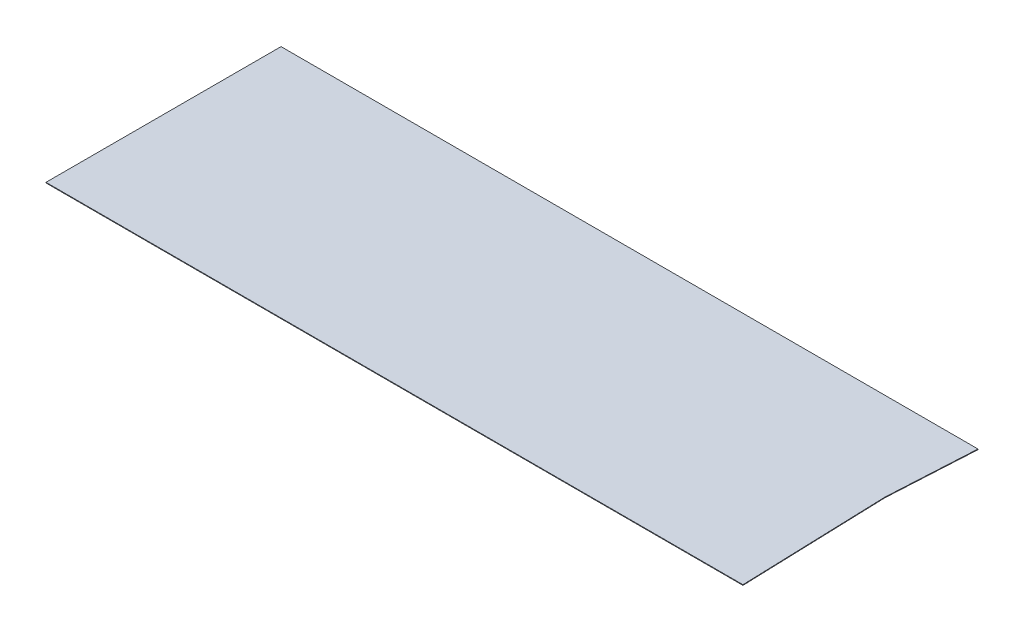
ISO-10303-21;
HEADER;
FILE_DESCRIPTION(('STEP AP214'),'2;1');
FILE_NAME('part.step','',(''),(''),'','','');
FILE_SCHEMA(('AUTOMOTIVE_DESIGN { 1 0 10303 214 1 1 1 1 }'));
ENDSEC;
DATA;
#1=APPLICATION_CONTEXT('core data for automotive mechanical design processes');
#2=APPLICATION_PROTOCOL_DEFINITION('international standard','automotive_design',2000,#1);
#3=PRODUCT_CONTEXT('',#1,'mechanical');
#4=PRODUCT('Part','Part','',(#3));
#5=PRODUCT_RELATED_PRODUCT_CATEGORY('part','',(#4));
#6=PRODUCT_DEFINITION_FORMATION('','',#4);
#7=PRODUCT_DEFINITION_CONTEXT('part definition',#1,'design');
#8=PRODUCT_DEFINITION('design','',#6,#7);
#9=PRODUCT_DEFINITION_SHAPE('','',#8);
#10=(LENGTH_UNIT() NAMED_UNIT(*) SI_UNIT(.MILLI.,.METRE.));
#11=(NAMED_UNIT(*) PLANE_ANGLE_UNIT() SI_UNIT($,.RADIAN.));
#12=(NAMED_UNIT(*) SI_UNIT($,.STERADIAN.) SOLID_ANGLE_UNIT());
#13=UNCERTAINTY_MEASURE_WITH_UNIT(LENGTH_MEASURE(1.E-05),#10,'distance_accuracy_value','');
#14=(GEOMETRIC_REPRESENTATION_CONTEXT(3) GLOBAL_UNCERTAINTY_ASSIGNED_CONTEXT((#13)) GLOBAL_UNIT_ASSIGNED_CONTEXT((#10,
#11,#12)) REPRESENTATION_CONTEXT('',''));
#15=CARTESIAN_POINT('',(0.,0.,0.));
#16=DIRECTION('',(0.,0.,1.));
#17=DIRECTION('',(1.,0.,0.));
#18=AXIS2_PLACEMENT_3D('',#15,#16,#17);
#19=CARTESIAN_POINT('',(-897.89,1.5875,304.8));
#20=DIRECTION('',(0.,0.,-1.));
#21=DIRECTION('',(-1.,0.,0.));
#22=AXIS2_PLACEMENT_3D('',#19,#20,#21);
#23=PLANE('',#22);
#24=DIRECTION('',(1.,0.,0.));
#25=VECTOR('',#24,1.);
#26=CARTESIAN_POINT('',(-897.89,0.,304.8));
#27=LINE('',#26,#25);
#28=CARTESIAN_POINT('',(-897.89,0.,304.8));
#29=VERTEX_POINT('',#28);
#30=CARTESIAN_POINT('',(909.766604995533,0.,304.8));
#31=VERTEX_POINT('',#30);
#32=EDGE_CURVE('E108',#29,#31,#27,.T.);
#33=ORIENTED_EDGE('',*,*,#32,.T.);
#34=DIRECTION('',(0.,-1.,0.));
#35=VECTOR('',#34,1.);
#36=CARTESIAN_POINT('',(909.766604995533,1.5875,304.8));
#37=LINE('',#36,#35);
#38=CARTESIAN_POINT('',(909.766604995533,1.5875,304.8));
#39=VERTEX_POINT('',#38);
#40=EDGE_CURVE('E11',#39,#31,#37,.T.);
#41=ORIENTED_EDGE('',*,*,#40,.F.);
#42=DIRECTION('',(1.,0.,0.));
#43=VECTOR('',#42,1.);
#44=CARTESIAN_POINT('',(-897.89,1.5875,304.8));
#45=LINE('',#44,#43);
#46=CARTESIAN_POINT('',(-897.89,1.5875,304.8));
#47=VERTEX_POINT('',#46);
#48=EDGE_CURVE('E116',#47,#39,#45,.T.);
#49=ORIENTED_EDGE('',*,*,#48,.F.);
#50=DIRECTION('',(0.,-1.,0.));
#51=VECTOR('',#50,1.);
#52=CARTESIAN_POINT('',(-897.89,1.5875,304.8));
#53=LINE('',#52,#51);
#54=EDGE_CURVE('E104',#47,#29,#53,.T.);
#55=ORIENTED_EDGE('',*,*,#54,.T.);
#56=EDGE_LOOP('',(#33,#41,#49,#55));
#57=FACE_BOUND('',#56,.T.);
#58=ADVANCED_FACE('F34',(#57),#23,.F.);
#59=CARTESIAN_POINT('',(909.766604995533,1.5875,304.8));
#60=DIRECTION('',(-0.999444906979154,0.,0.0333148302326386));
#61=DIRECTION('',(0.0333148302326386,0.,0.999444906979154));
#62=AXIS2_PLACEMENT_3D('',#59,#60,#61);
#63=PLANE('',#62);
#64=DIRECTION('',(-0.0333148302326386,0.,-0.999444906979154));
#65=VECTOR('',#64,1.);
#66=CARTESIAN_POINT('',(909.766604995533,0.,304.8));
#67=LINE('',#66,#65);
#68=CARTESIAN_POINT('',(897.066604995533,0.,-76.1999999999998));
#69=VERTEX_POINT('',#68);
#70=EDGE_CURVE('E111',#31,#69,#67,.T.);
#71=ORIENTED_EDGE('',*,*,#70,.T.);
#72=DIRECTION('',(0.,-1.,0.));
#73=VECTOR('',#72,1.);
#74=CARTESIAN_POINT('',(897.066604995533,1.5875,-76.1999999999998));
#75=LINE('',#74,#73);
#76=CARTESIAN_POINT('',(897.066604995533,1.5875,-76.1999999999998));
#77=VERTEX_POINT('',#76);
#78=EDGE_CURVE('E42',#77,#69,#75,.T.);
#79=ORIENTED_EDGE('',*,*,#78,.F.);
#80=DIRECTION('',(-0.0333148302326386,0.,-0.999444906979154));
#81=VECTOR('',#80,1.);
#82=CARTESIAN_POINT('',(909.766604995533,1.5875,304.8));
#83=LINE('',#82,#81);
#84=EDGE_CURVE('E84',#39,#77,#83,.T.);
#85=ORIENTED_EDGE('',*,*,#84,.F.);
#86=ORIENTED_EDGE('',*,*,#40,.T.);
#87=EDGE_LOOP('',(#71,#79,#85,#86));
#88=FACE_BOUND('',#87,.T.);
#89=ADVANCED_FACE('F135',(#88),#63,.F.);
#90=CARTESIAN_POINT('',(897.066604995533,1.5875,-76.1999999999998));
#91=DIRECTION('',(-0.998460353205412,0.,-0.0554700196225226));
#92=DIRECTION('',(-0.0554700196225226,0.,0.998460353205413));
#93=AXIS2_PLACEMENT_3D('',#90,#91,#92);
#94=PLANE('',#93);
#95=DIRECTION('',(0.0554700196225226,0.,-0.998460353205412));
#96=VECTOR('',#95,1.);
#97=CARTESIAN_POINT('',(897.066604995533,0.,-76.1999999999998));
#98=LINE('',#97,#96);
#99=CARTESIAN_POINT('',(909.766604995533,0.,-304.8));
#100=VERTEX_POINT('',#99);
#101=EDGE_CURVE('E99',#69,#100,#98,.T.);
#102=ORIENTED_EDGE('',*,*,#101,.T.);
#103=DIRECTION('',(0.,-1.,0.));
#104=VECTOR('',#103,1.);
#105=CARTESIAN_POINT('',(909.766604995533,1.5875,-304.8));
#106=LINE('',#105,#104);
#107=CARTESIAN_POINT('',(909.766604995533,1.5875,-304.8));
#108=VERTEX_POINT('',#107);
#109=EDGE_CURVE('E96',#108,#100,#106,.T.);
#110=ORIENTED_EDGE('',*,*,#109,.F.);
#111=DIRECTION('',(0.0554700196225226,0.,-0.998460353205412));
#112=VECTOR('',#111,1.);
#113=CARTESIAN_POINT('',(897.066604995533,1.5875,-76.1999999999998));
#114=LINE('',#113,#112);
#115=EDGE_CURVE('E88',#77,#108,#114,.T.);
#116=ORIENTED_EDGE('',*,*,#115,.F.);
#117=ORIENTED_EDGE('',*,*,#78,.T.);
#118=EDGE_LOOP('',(#102,#110,#116,#117));
#119=FACE_BOUND('',#118,.T.);
#120=ADVANCED_FACE('F97',(#119),#94,.F.);
#121=CARTESIAN_POINT('',(-897.89,1.5875,-304.8));
#122=DIRECTION('',(0.,0.,1.));
#123=DIRECTION('',(1.,0.,0.));
#124=AXIS2_PLACEMENT_3D('',#121,#122,#123);
#125=PLANE('',#124);
#126=DIRECTION('',(-1.,0.,0.));
#127=VECTOR('',#126,1.);
#128=CARTESIAN_POINT('',(-897.89,0.,-304.8));
#129=LINE('',#128,#127);
#130=CARTESIAN_POINT('',(-897.89,0.,-304.8));
#131=VERTEX_POINT('',#130);
#132=EDGE_CURVE('E70',#100,#131,#129,.T.);
#133=ORIENTED_EDGE('',*,*,#132,.T.);
#134=DIRECTION('',(0.,-1.,0.));
#135=VECTOR('',#134,1.);
#136=CARTESIAN_POINT('',(-897.89,1.5875,-304.8));
#137=LINE('',#136,#135);
#138=CARTESIAN_POINT('',(-897.89,1.5875,-304.8));
#139=VERTEX_POINT('',#138);
#140=EDGE_CURVE('E100',#139,#131,#137,.T.);
#141=ORIENTED_EDGE('',*,*,#140,.F.);
#142=DIRECTION('',(-1.,0.,0.));
#143=VECTOR('',#142,1.);
#144=CARTESIAN_POINT('',(-897.89,1.5875,-304.8));
#145=LINE('',#144,#143);
#146=EDGE_CURVE('E92',#108,#139,#145,.T.);
#147=ORIENTED_EDGE('',*,*,#146,.F.);
#148=ORIENTED_EDGE('',*,*,#109,.T.);
#149=EDGE_LOOP('',(#133,#141,#147,#148));
#150=FACE_BOUND('',#149,.T.);
#151=ADVANCED_FACE('F102',(#150),#125,.F.);
#152=CARTESIAN_POINT('',(-897.89,1.5875,-304.8));
#153=DIRECTION('',(1.,0.,0.));
#154=DIRECTION('',(0.,0.,-1.));
#155=AXIS2_PLACEMENT_3D('',#152,#153,#154);
#156=PLANE('',#155);
#157=DIRECTION('',(0.,0.,1.));
#158=VECTOR('',#157,1.);
#159=CARTESIAN_POINT('',(-897.89,0.,-304.8));
#160=LINE('',#159,#158);
#161=EDGE_CURVE('E76',#131,#29,#160,.T.);
#162=ORIENTED_EDGE('',*,*,#161,.T.);
#163=ORIENTED_EDGE('',*,*,#54,.F.);
#164=DIRECTION('',(0.,0.,1.));
#165=VECTOR('',#164,1.);
#166=CARTESIAN_POINT('',(-897.89,1.5875,-304.8));
#167=LINE('',#166,#165);
#168=EDGE_CURVE('E50',#139,#47,#167,.T.);
#169=ORIENTED_EDGE('',*,*,#168,.F.);
#170=ORIENTED_EDGE('',*,*,#140,.T.);
#171=EDGE_LOOP('',(#162,#163,#169,#170));
#172=FACE_BOUND('',#171,.T.);
#173=ADVANCED_FACE('F124',(#172),#156,.F.);
#174=CARTESIAN_POINT('',(0.,1.5875,0.));
#175=DIRECTION('',(0.,-1.,0.));
#176=DIRECTION('',(0.,0.,-1.));
#177=AXIS2_PLACEMENT_3D('',#174,#175,#176);
#178=PLANE('',#177);
#179=ORIENTED_EDGE('',*,*,#48,.T.);
#180=ORIENTED_EDGE('',*,*,#84,.T.);
#181=ORIENTED_EDGE('',*,*,#115,.T.);
#182=ORIENTED_EDGE('',*,*,#146,.T.);
#183=ORIENTED_EDGE('',*,*,#168,.T.);
#184=EDGE_LOOP('',(#179,#180,#181,#182,#183));
#185=FACE_BOUND('',#184,.T.);
#186=ADVANCED_FACE('F90',(#185),#178,.F.);
#187=CARTESIAN_POINT('',(0.,0.,0.));
#188=DIRECTION('',(0.,-1.,0.));
#189=DIRECTION('',(0.,0.,-1.));
#190=AXIS2_PLACEMENT_3D('',#187,#188,#189);
#191=PLANE('',#190);
#192=ORIENTED_EDGE('',*,*,#32,.F.);
#193=ORIENTED_EDGE('',*,*,#161,.F.);
#194=ORIENTED_EDGE('',*,*,#132,.F.);
#195=ORIENTED_EDGE('',*,*,#101,.F.);
#196=ORIENTED_EDGE('',*,*,#70,.F.);
#197=EDGE_LOOP('',(#192,#193,#194,#195,#196));
#198=FACE_BOUND('',#197,.T.);
#199=ADVANCED_FACE('F120',(#198),#191,.T.);
#200=CLOSED_SHELL('',(#58,#89,#120,#151,#173,#186,#199));
#201=MANIFOLD_SOLID_BREP('B2',#200);
#202=ADVANCED_BREP_SHAPE_REPRESENTATION('',(#18,#201),#14);
#203=SHAPE_DEFINITION_REPRESENTATION(#9,#202);
ENDSEC;
END-ISO-10303-21;
